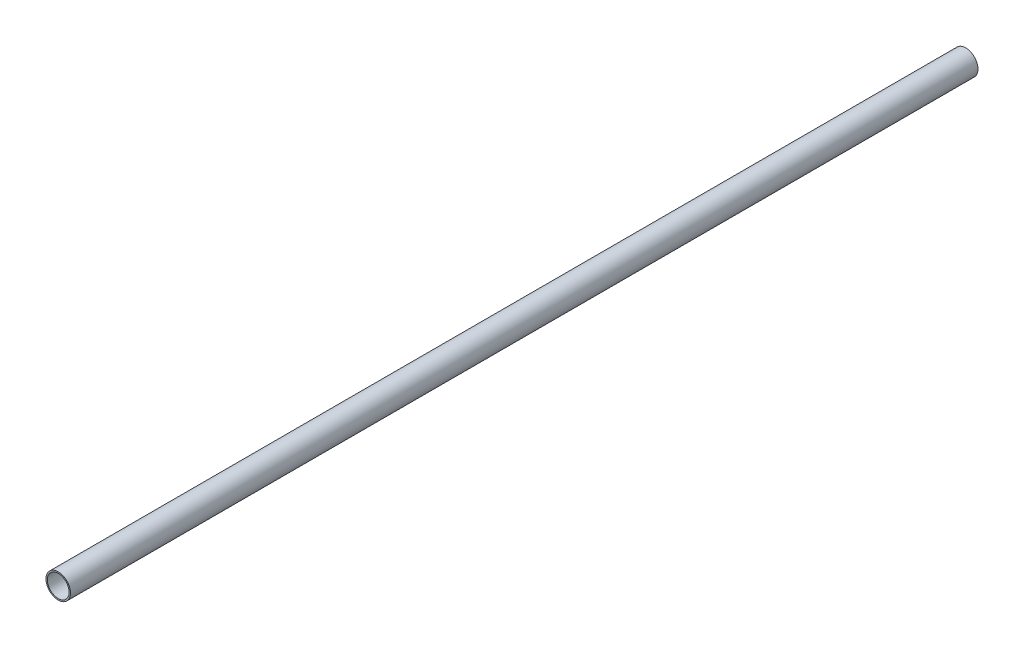
ISO-10303-21;
HEADER;
FILE_DESCRIPTION(('STEP AP214'),'2;1');
FILE_NAME('part.step','',(''),(''),'','','');
FILE_SCHEMA(('AUTOMOTIVE_DESIGN { 1 0 10303 214 1 1 1 1 }'));
ENDSEC;
DATA;
#1=APPLICATION_CONTEXT('core data for automotive mechanical design processes');
#2=APPLICATION_PROTOCOL_DEFINITION('international standard','automotive_design',2000,#1);
#3=PRODUCT_CONTEXT('',#1,'mechanical');
#4=PRODUCT('Part','Part','',(#3));
#5=PRODUCT_RELATED_PRODUCT_CATEGORY('part','',(#4));
#6=PRODUCT_DEFINITION_FORMATION('','',#4);
#7=PRODUCT_DEFINITION_CONTEXT('part definition',#1,'design');
#8=PRODUCT_DEFINITION('design','',#6,#7);
#9=PRODUCT_DEFINITION_SHAPE('','',#8);
#10=(LENGTH_UNIT() NAMED_UNIT(*) SI_UNIT(.MILLI.,.METRE.));
#11=(NAMED_UNIT(*) PLANE_ANGLE_UNIT() SI_UNIT($,.RADIAN.));
#12=(NAMED_UNIT(*) SI_UNIT($,.STERADIAN.) SOLID_ANGLE_UNIT());
#13=UNCERTAINTY_MEASURE_WITH_UNIT(LENGTH_MEASURE(1.E-05),#10,'distance_accuracy_value','');
#14=(GEOMETRIC_REPRESENTATION_CONTEXT(3) GLOBAL_UNCERTAINTY_ASSIGNED_CONTEXT((#13)) GLOBAL_UNIT_ASSIGNED_CONTEXT((#10,
#11,#12)) REPRESENTATION_CONTEXT('',''));
#15=CARTESIAN_POINT('',(0.,0.,0.));
#16=DIRECTION('',(0.,0.,1.));
#17=DIRECTION('',(1.,0.,0.));
#18=AXIS2_PLACEMENT_3D('',#15,#16,#17);
#19=CARTESIAN_POINT('',(0.,0.,1000.));
#20=DIRECTION('',(0.,0.,1.));
#21=DIRECTION('',(1.,0.,0.));
#22=AXIS2_PLACEMENT_3D('',#19,#20,#21);
#23=PLANE('',#22);
#24=CARTESIAN_POINT('',(0.,0.,1000.));
#25=DIRECTION('',(0.,0.,1.));
#26=DIRECTION('',(1.,0.,0.));
#27=AXIS2_PLACEMENT_3D('',#24,#25,#26);
#28=CIRCLE('',#27,13.5);
#29=CARTESIAN_POINT('',(13.5,0.,1000.));
#30=VERTEX_POINT('',#29);
#31=EDGE_CURVE('E10',#30,#30,#28,.T.);
#32=ORIENTED_EDGE('',*,*,#31,.T.);
#33=EDGE_LOOP('',(#32));
#34=FACE_BOUND('',#33,.T.);
#35=CARTESIAN_POINT('',(0.,0.,1000.));
#36=DIRECTION('',(0.,0.,1.));
#37=DIRECTION('',(1.,0.,0.));
#38=AXIS2_PLACEMENT_3D('',#35,#36,#37);
#39=CIRCLE('',#38,12.);
#40=CARTESIAN_POINT('',(12.,0.,1000.));
#41=VERTEX_POINT('',#40);
#42=EDGE_CURVE('E58',#41,#41,#39,.T.);
#43=ORIENTED_EDGE('',*,*,#42,.F.);
#44=EDGE_LOOP('',(#43));
#45=FACE_BOUND('',#44,.T.);
#46=ADVANCED_FACE('F45',(#34,#45),#23,.T.);
#47=CARTESIAN_POINT('',(0.,0.,0.));
#48=DIRECTION('',(0.,0.,1.));
#49=DIRECTION('',(1.,0.,0.));
#50=AXIS2_PLACEMENT_3D('',#47,#48,#49);
#51=PLANE('',#50);
#52=CARTESIAN_POINT('',(0.,0.,0.));
#53=DIRECTION('',(0.,0.,1.));
#54=DIRECTION('',(1.,0.,0.));
#55=AXIS2_PLACEMENT_3D('',#52,#53,#54);
#56=CIRCLE('',#55,13.5);
#57=CARTESIAN_POINT('',(13.5,0.,0.));
#58=VERTEX_POINT('',#57);
#59=EDGE_CURVE('E49',#58,#58,#56,.T.);
#60=ORIENTED_EDGE('',*,*,#59,.F.);
#61=EDGE_LOOP('',(#60));
#62=FACE_BOUND('',#61,.T.);
#63=CARTESIAN_POINT('',(0.,0.,0.));
#64=DIRECTION('',(0.,0.,1.));
#65=DIRECTION('',(1.,0.,0.));
#66=AXIS2_PLACEMENT_3D('',#63,#64,#65);
#67=CIRCLE('',#66,12.);
#68=CARTESIAN_POINT('',(12.,0.,0.));
#69=VERTEX_POINT('',#68);
#70=EDGE_CURVE('E60',#69,#69,#67,.T.);
#71=ORIENTED_EDGE('',*,*,#70,.T.);
#72=EDGE_LOOP('',(#71));
#73=FACE_BOUND('',#72,.T.);
#74=ADVANCED_FACE('F72',(#62,#73),#51,.F.);
#75=CARTESIAN_POINT('',(0.,0.,1000.));
#76=DIRECTION('',(0.,0.,-1.));
#77=DIRECTION('',(-1.,0.,0.));
#78=AXIS2_PLACEMENT_3D('',#75,#76,#77);
#79=CYLINDRICAL_SURFACE('',#78,13.5);
#80=ORIENTED_EDGE('',*,*,#31,.F.);
#81=EDGE_LOOP('',(#80));
#82=FACE_BOUND('',#81,.T.);
#83=ORIENTED_EDGE('',*,*,#59,.T.);
#84=EDGE_LOOP('',(#83));
#85=FACE_BOUND('',#84,.T.);
#86=ADVANCED_FACE('F47',(#82,#85),#79,.T.);
#87=CARTESIAN_POINT('',(0.,0.,1000.));
#88=DIRECTION('',(0.,0.,-1.));
#89=DIRECTION('',(-1.,0.,0.));
#90=AXIS2_PLACEMENT_3D('',#87,#88,#89);
#91=CYLINDRICAL_SURFACE('',#90,12.);
#92=ORIENTED_EDGE('',*,*,#42,.T.);
#93=EDGE_LOOP('',(#92));
#94=FACE_BOUND('',#93,.T.);
#95=ORIENTED_EDGE('',*,*,#70,.F.);
#96=EDGE_LOOP('',(#95));
#97=FACE_BOUND('',#96,.T.);
#98=ADVANCED_FACE('F68',(#94,#97),#91,.F.);
#99=CLOSED_SHELL('',(#46,#74,#86,#98));
#100=MANIFOLD_SOLID_BREP('B2',#99);
#101=ADVANCED_BREP_SHAPE_REPRESENTATION('',(#18,#100),#14);
#102=SHAPE_DEFINITION_REPRESENTATION(#9,#101);
ENDSEC;
END-ISO-10303-21;
